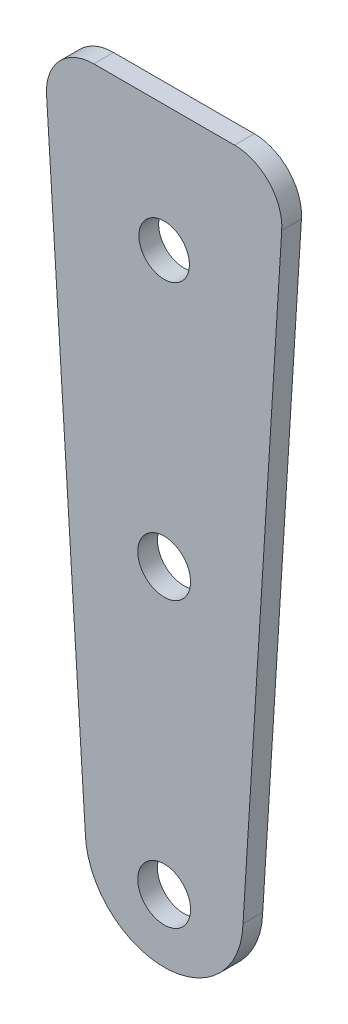
ISO-10303-21;
HEADER;
FILE_DESCRIPTION(('STEP AP214'),'2;1');
FILE_NAME('part.step','',(''),(''),'','','');
FILE_SCHEMA(('AUTOMOTIVE_DESIGN { 1 0 10303 214 1 1 1 1 }'));
ENDSEC;
DATA;
#1=APPLICATION_CONTEXT('core data for automotive mechanical design processes');
#2=APPLICATION_PROTOCOL_DEFINITION('international standard','automotive_design',2000,#1);
#3=PRODUCT_CONTEXT('',#1,'mechanical');
#4=PRODUCT('Part','Part','',(#3));
#5=PRODUCT_RELATED_PRODUCT_CATEGORY('part','',(#4));
#6=PRODUCT_DEFINITION_FORMATION('','',#4);
#7=PRODUCT_DEFINITION_CONTEXT('part definition',#1,'design');
#8=PRODUCT_DEFINITION('design','',#6,#7);
#9=PRODUCT_DEFINITION_SHAPE('','',#8);
#10=(LENGTH_UNIT() NAMED_UNIT(*) SI_UNIT(.MILLI.,.METRE.));
#11=(NAMED_UNIT(*) PLANE_ANGLE_UNIT() SI_UNIT($,.RADIAN.));
#12=(NAMED_UNIT(*) SI_UNIT($,.STERADIAN.) SOLID_ANGLE_UNIT());
#13=UNCERTAINTY_MEASURE_WITH_UNIT(LENGTH_MEASURE(1.E-05),#10,'distance_accuracy_value','');
#14=(GEOMETRIC_REPRESENTATION_CONTEXT(3) GLOBAL_UNCERTAINTY_ASSIGNED_CONTEXT((#13)) GLOBAL_UNIT_ASSIGNED_CONTEXT((#10,
#11,#12)) REPRESENTATION_CONTEXT('',''));
#15=CARTESIAN_POINT('',(0.,0.,0.));
#16=DIRECTION('',(0.,0.,1.));
#17=DIRECTION('',(1.,0.,0.));
#18=AXIS2_PLACEMENT_3D('',#15,#16,#17);
#19=CARTESIAN_POINT('',(0.0147414642697603,-105.114260788739,-76.2));
#20=DIRECTION('',(0.,0.,1.));
#21=DIRECTION('',(1.,0.,0.));
#22=AXIS2_PLACEMENT_3D('',#19,#20,#21);
#23=CYLINDRICAL_SURFACE('',#22,6.35136235795166);
#24=DIRECTION('',(0.,0.,1.));
#25=VECTOR('',#24,1.);
#26=CARTESIAN_POINT('',(-6.33525853573024,-105.24580470538,-76.2));
#27=LINE('',#26,#25);
#28=CARTESIAN_POINT('',(-6.33525853573024,-105.24580470538,45.9104999999999));
#29=VERTEX_POINT('',#28);
#30=CARTESIAN_POINT('',(-6.33525853573024,-105.24580470538,47.4979999999999));
#31=VERTEX_POINT('',#30);
#32=EDGE_CURVE('E119',#29,#31,#27,.T.);
#33=ORIENTED_EDGE('',*,*,#32,.F.);
#34=CARTESIAN_POINT('',(0.0147414642697603,-105.114260788739,45.9104999999999));
#35=DIRECTION('',(0.,0.,1.));
#36=DIRECTION('',(1.,0.,0.));
#37=AXIS2_PLACEMENT_3D('',#34,#35,#36);
#38=CIRCLE('',#37,6.35136235795166);
#39=CARTESIAN_POINT('',(6.36474146426976,-105.24580470538,45.9104999999999));
#40=VERTEX_POINT('',#39);
#41=EDGE_CURVE('E122',#40,#29,#38,.F.);
#42=ORIENTED_EDGE('',*,*,#41,.F.);
#43=DIRECTION('',(0.,0.,1.));
#44=VECTOR('',#43,1.);
#45=CARTESIAN_POINT('',(6.36474146426976,-105.24580470538,-76.2));
#46=LINE('',#45,#44);
#47=CARTESIAN_POINT('',(6.36474146426976,-105.24580470538,47.4979999999999));
#48=VERTEX_POINT('',#47);
#49=EDGE_CURVE('E115',#40,#48,#46,.T.);
#50=ORIENTED_EDGE('',*,*,#49,.T.);
#51=CARTESIAN_POINT('',(0.0147414642697603,-105.114260788739,47.4979999999999));
#52=DIRECTION('',(0.,0.,-1.));
#53=DIRECTION('',(-1.,0.,0.));
#54=AXIS2_PLACEMENT_3D('',#51,#52,#53);
#55=CIRCLE('',#54,6.35136235795166);
#56=EDGE_CURVE('E97',#31,#48,#55,.F.);
#57=ORIENTED_EDGE('',*,*,#56,.F.);
#58=EDGE_LOOP('',(#33,#42,#50,#57));
#59=FACE_BOUND('',#58,.T.);
#60=ADVANCED_FACE('F41',(#59),#23,.T.);
#61=CARTESIAN_POINT('',(-6.33525853573024,-105.24580470538,-76.2));
#62=DIRECTION('',(-0.998052578482889,-0.0623782861551806,0.));
#63=DIRECTION('',(0.0623782861551806,-0.998052578482889,0.));
#64=AXIS2_PLACEMENT_3D('',#61,#62,#63);
#65=PLANE('',#64);
#66=DIRECTION('',(-0.0623782861551806,0.998052578482889,0.));
#67=VECTOR('',#66,1.);
#68=CARTESIAN_POINT('',(-6.33525853573024,-105.24580470538,45.9104999999999));
#69=LINE('',#68,#67);
#70=CARTESIAN_POINT('',(-9.45391718746499,-55.3472662776241,45.9104999999999));
#71=VERTEX_POINT('',#70);
#72=EDGE_CURVE('E59',#29,#71,#69,.T.);
#73=ORIENTED_EDGE('',*,*,#72,.F.);
#74=ORIENTED_EDGE('',*,*,#32,.T.);
#75=DIRECTION('',(0.0623782861551806,-0.998052578482889,0.));
#76=VECTOR('',#75,1.);
#77=CARTESIAN_POINT('',(-6.33525853573024,-105.24580470538,47.4979999999999));
#78=LINE('',#77,#76);
#79=CARTESIAN_POINT('',(-9.45391718746499,-55.3472662776241,47.4979999999999));
#80=VERTEX_POINT('',#79);
#81=EDGE_CURVE('E103',#80,#31,#78,.T.);
#82=ORIENTED_EDGE('',*,*,#81,.F.);
#83=DIRECTION('',(0.,0.,1.));
#84=VECTOR('',#83,1.);
#85=CARTESIAN_POINT('',(-9.45391718746499,-55.3472662776241,-47.625));
#86=LINE('',#85,#84);
#87=EDGE_CURVE('E11',#80,#71,#86,.F.);
#88=ORIENTED_EDGE('',*,*,#87,.T.);
#89=EDGE_LOOP('',(#73,#74,#82,#88));
#90=FACE_BOUND('',#89,.T.);
#91=ADVANCED_FACE('F214',(#90),#65,.T.);
#92=CARTESIAN_POINT('',(6.36474146426976,-105.24580470538,-76.2));
#93=DIRECTION('',(0.998052578482889,-0.0623782861551805,0.));
#94=DIRECTION('',(0.0623782861551805,0.998052578482889,0.));
#95=AXIS2_PLACEMENT_3D('',#92,#93,#94);
#96=PLANE('',#95);
#97=DIRECTION('',(-0.0623782861551805,-0.998052578482889,0.));
#98=VECTOR('',#97,1.);
#99=CARTESIAN_POINT('',(6.36474146426976,-105.24580470538,45.9104999999999));
#100=LINE('',#99,#98);
#101=CARTESIAN_POINT('',(9.4834001160045,-55.3472662776241,45.9104999999999));
#102=VERTEX_POINT('',#101);
#103=EDGE_CURVE('E151',#102,#40,#100,.T.);
#104=ORIENTED_EDGE('',*,*,#103,.F.);
#105=DIRECTION('',(0.,0.,-1.));
#106=VECTOR('',#105,1.);
#107=CARTESIAN_POINT('',(9.4834001160045,-55.3472662776241,47.4979999999999));
#108=LINE('',#107,#106);
#109=CARTESIAN_POINT('',(9.4834001160045,-55.3472662776241,47.4979999999999));
#110=VERTEX_POINT('',#109);
#111=EDGE_CURVE('E117',#102,#110,#108,.F.);
#112=ORIENTED_EDGE('',*,*,#111,.T.);
#113=DIRECTION('',(0.0623782861551805,0.998052578482889,0.));
#114=VECTOR('',#113,1.);
#115=CARTESIAN_POINT('',(6.36474146426976,-105.24580470538,47.4979999999999));
#116=LINE('',#115,#114);
#117=EDGE_CURVE('E101',#48,#110,#116,.T.);
#118=ORIENTED_EDGE('',*,*,#117,.F.);
#119=ORIENTED_EDGE('',*,*,#49,.F.);
#120=EDGE_LOOP('',(#104,#112,#118,#119));
#121=FACE_BOUND('',#120,.T.);
#122=ADVANCED_FACE('F114',(#121),#96,.T.);
#123=CARTESIAN_POINT('',(-12.6852585357302,-51.2996050073729,47.4979999999999));
#124=DIRECTION('',(0.,-1.,0.));
#125=DIRECTION('',(0.,0.,-1.));
#126=AXIS2_PLACEMENT_3D('',#123,#124,#125);
#127=PLANE('',#126);
#128=DIRECTION('',(0.,0.,-1.));
#129=VECTOR('',#128,1.);
#130=CARTESIAN_POINT('',(5.6808197919847,-51.2996050073729,-47.625));
#131=LINE('',#130,#129);
#132=CARTESIAN_POINT('',(5.6808197919847,-51.2996050073729,47.4979999999999));
#133=VERTEX_POINT('',#132);
#134=CARTESIAN_POINT('',(5.6808197919847,-51.2996050073729,45.9104999999999));
#135=VERTEX_POINT('',#134);
#136=EDGE_CURVE('E136',#133,#135,#131,.T.);
#137=ORIENTED_EDGE('',*,*,#136,.T.);
#138=DIRECTION('',(-1.,0.,0.));
#139=VECTOR('',#138,1.);
#140=CARTESIAN_POINT('',(-12.6852585357302,-51.2996050073729,45.9104999999999));
#141=LINE('',#140,#139);
#142=CARTESIAN_POINT('',(-5.65133686344518,-51.2996050073729,45.9104999999999));
#143=VERTEX_POINT('',#142);
#144=EDGE_CURVE('E162',#135,#143,#141,.T.);
#145=ORIENTED_EDGE('',*,*,#144,.T.);
#146=DIRECTION('',(0.,0.,1.));
#147=VECTOR('',#146,1.);
#148=CARTESIAN_POINT('',(-5.65133686344518,-51.2996050073729,47.4979999999999));
#149=LINE('',#148,#147);
#150=CARTESIAN_POINT('',(-5.65133686344518,-51.2996050073729,47.4979999999999));
#151=VERTEX_POINT('',#150);
#152=EDGE_CURVE('E133',#143,#151,#149,.T.);
#153=ORIENTED_EDGE('',*,*,#152,.T.);
#154=DIRECTION('',(1.,0.,0.));
#155=VECTOR('',#154,1.);
#156=CARTESIAN_POINT('',(-12.6852585357302,-51.2996050073729,47.4979999999999));
#157=LINE('',#156,#155);
#158=EDGE_CURVE('E128',#151,#133,#157,.T.);
#159=ORIENTED_EDGE('',*,*,#158,.T.);
#160=EDGE_LOOP('',(#137,#145,#153,#159));
#161=FACE_BOUND('',#160,.T.);
#162=ADVANCED_FACE('F200',(#161),#127,.F.);
#163=CARTESIAN_POINT('',(-12.6852585357302,-73.5246050073729,47.4979999999999));
#164=DIRECTION('',(0.,0.,-1.));
#165=DIRECTION('',(-1.,0.,0.));
#166=AXIS2_PLACEMENT_3D('',#163,#164,#165);
#167=PLANE('',#166);
#168=CARTESIAN_POINT('',(0.0147414642697539,-106.385623146691,47.4979999999999));
#169=DIRECTION('',(0.,0.,1.));
#170=DIRECTION('',(1.,0.,0.));
#171=AXIS2_PLACEMENT_3D('',#168,#169,#170);
#172=CIRCLE('',#171,2.127);
#173=CARTESIAN_POINT('',(2.14174146426975,-106.385623146691,47.4979999999999));
#174=VERTEX_POINT('',#173);
#175=EDGE_CURVE('E179',#174,#174,#172,.T.);
#176=ORIENTED_EDGE('',*,*,#175,.F.);
#177=EDGE_LOOP('',(#176));
#178=FACE_BOUND('',#177,.T.);
#179=CARTESIAN_POINT('',(0.0147414642697511,-83.5256231466905,47.4979999999999));
#180=DIRECTION('',(0.,0.,1.));
#181=DIRECTION('',(1.,0.,0.));
#182=AXIS2_PLACEMENT_3D('',#179,#180,#181);
#183=CIRCLE('',#182,2.127);
#184=CARTESIAN_POINT('',(2.14174146426975,-83.5256231466905,47.4979999999999));
#185=VERTEX_POINT('',#184);
#186=EDGE_CURVE('E171',#185,#185,#183,.T.);
#187=ORIENTED_EDGE('',*,*,#186,.F.);
#188=EDGE_LOOP('',(#187));
#189=FACE_BOUND('',#188,.T.);
#190=ORIENTED_EDGE('',*,*,#56,.T.);
#191=ORIENTED_EDGE('',*,*,#117,.T.);
#192=CARTESIAN_POINT('',(5.6808197919847,-55.1096050073729,47.4979999999999));
#193=DIRECTION('',(0.,0.,-1.));
#194=DIRECTION('',(-1.,0.,0.));
#195=AXIS2_PLACEMENT_3D('',#192,#193,#194);
#196=CIRCLE('',#195,3.81);
#197=EDGE_CURVE('E51',#110,#133,#196,.F.);
#198=ORIENTED_EDGE('',*,*,#197,.T.);
#199=ORIENTED_EDGE('',*,*,#158,.F.);
#200=CARTESIAN_POINT('',(-5.65133686344518,-55.1096050073729,47.4979999999999));
#201=DIRECTION('',(0.,0.,-1.));
#202=DIRECTION('',(-1.,0.,0.));
#203=AXIS2_PLACEMENT_3D('',#200,#201,#202);
#204=CIRCLE('',#203,3.81);
#205=EDGE_CURVE('E67',#151,#80,#204,.F.);
#206=ORIENTED_EDGE('',*,*,#205,.T.);
#207=ORIENTED_EDGE('',*,*,#81,.T.);
#208=EDGE_LOOP('',(#190,#191,#198,#199,#206,#207));
#209=FACE_BOUND('',#208,.T.);
#210=CARTESIAN_POINT('',(0.0147414642697558,-61.4596050073729,47.4979999999999));
#211=DIRECTION('',(0.,0.,-1.));
#212=DIRECTION('',(-1.,0.,0.));
#213=AXIS2_PLACEMENT_3D('',#210,#211,#212);
#214=CIRCLE('',#213,2.032);
#215=CARTESIAN_POINT('',(-2.01725853573024,-61.4596050073729,47.4979999999999));
#216=VERTEX_POINT('',#215);
#217=EDGE_CURVE('E143',#216,#216,#214,.T.);
#218=ORIENTED_EDGE('',*,*,#217,.T.);
#219=EDGE_LOOP('',(#218));
#220=FACE_BOUND('',#219,.T.);
#221=ADVANCED_FACE('F99',(#178,#189,#209,#220),#167,.F.);
#222=CARTESIAN_POINT('',(5.6808197919847,-55.1096050073729,47.4979999999999));
#223=DIRECTION('',(0.,0.,1.));
#224=DIRECTION('',(1.,0.,0.));
#225=AXIS2_PLACEMENT_3D('',#222,#223,#224);
#226=CYLINDRICAL_SURFACE('',#225,3.81);
#227=CARTESIAN_POINT('',(5.6808197919847,-55.1096050073729,45.9104999999999));
#228=DIRECTION('',(0.,0.,1.));
#229=DIRECTION('',(1.,0.,0.));
#230=AXIS2_PLACEMENT_3D('',#227,#228,#229);
#231=CIRCLE('',#230,3.81);
#232=EDGE_CURVE('E154',#135,#102,#231,.F.);
#233=ORIENTED_EDGE('',*,*,#232,.F.);
#234=ORIENTED_EDGE('',*,*,#136,.F.);
#235=ORIENTED_EDGE('',*,*,#197,.F.);
#236=ORIENTED_EDGE('',*,*,#111,.F.);
#237=EDGE_LOOP('',(#233,#234,#235,#236));
#238=FACE_BOUND('',#237,.T.);
#239=ADVANCED_FACE('F199',(#238),#226,.T.);
#240=CARTESIAN_POINT('',(-5.65133686344518,-55.1096050073729,47.4979999999999));
#241=DIRECTION('',(0.,0.,-1.));
#242=DIRECTION('',(-1.,0.,0.));
#243=AXIS2_PLACEMENT_3D('',#240,#241,#242);
#244=CYLINDRICAL_SURFACE('',#243,3.81);
#245=CARTESIAN_POINT('',(-5.65133686344518,-55.1096050073729,45.9104999999999));
#246=DIRECTION('',(0.,0.,1.));
#247=DIRECTION('',(1.,0.,0.));
#248=AXIS2_PLACEMENT_3D('',#245,#246,#247);
#249=CIRCLE('',#248,3.81);
#250=EDGE_CURVE('E165',#71,#143,#249,.F.);
#251=ORIENTED_EDGE('',*,*,#250,.F.);
#252=ORIENTED_EDGE('',*,*,#87,.F.);
#253=ORIENTED_EDGE('',*,*,#205,.F.);
#254=ORIENTED_EDGE('',*,*,#152,.F.);
#255=EDGE_LOOP('',(#251,#252,#253,#254));
#256=FACE_BOUND('',#255,.T.);
#257=ADVANCED_FACE('F43',(#256),#244,.T.);
#258=CARTESIAN_POINT('',(0.0147414642697558,-61.4596050073729,60.1979999999999));
#259=DIRECTION('',(0.,0.,-1.));
#260=DIRECTION('',(-1.,0.,0.));
#261=AXIS2_PLACEMENT_3D('',#258,#259,#260);
#262=CYLINDRICAL_SURFACE('',#261,2.032);
#263=CARTESIAN_POINT('',(0.0147414642697558,-61.4596050073729,45.9104999999999));
#264=DIRECTION('',(0.,0.,1.));
#265=DIRECTION('',(1.,0.,0.));
#266=AXIS2_PLACEMENT_3D('',#263,#264,#265);
#267=CIRCLE('',#266,2.032);
#268=CARTESIAN_POINT('',(2.04674146426976,-61.4596050073729,45.9104999999999));
#269=VERTEX_POINT('',#268);
#270=EDGE_CURVE('E45',#269,#269,#267,.F.);
#271=ORIENTED_EDGE('',*,*,#270,.T.);
#272=EDGE_LOOP('',(#271));
#273=FACE_BOUND('',#272,.T.);
#274=ORIENTED_EDGE('',*,*,#217,.F.);
#275=EDGE_LOOP('',(#274));
#276=FACE_BOUND('',#275,.T.);
#277=ADVANCED_FACE('F210',(#273,#276),#262,.F.);
#278=CARTESIAN_POINT('',(-65.0326399581992,-111.465623146691,45.9104999999999));
#279=DIRECTION('',(0.,0.,1.));
#280=DIRECTION('',(1.,0.,0.));
#281=AXIS2_PLACEMENT_3D('',#278,#279,#280);
#282=PLANE('',#281);
#283=CARTESIAN_POINT('',(0.0147414642697539,-106.385623146691,45.9104999999999));
#284=DIRECTION('',(0.,0.,1.));
#285=DIRECTION('',(1.,0.,0.));
#286=AXIS2_PLACEMENT_3D('',#283,#284,#285);
#287=CIRCLE('',#286,2.127);
#288=CARTESIAN_POINT('',(2.14174146426975,-106.385623146691,45.9104999999999));
#289=VERTEX_POINT('',#288);
#290=EDGE_CURVE('E109',#289,#289,#287,.T.);
#291=ORIENTED_EDGE('',*,*,#290,.T.);
#292=EDGE_LOOP('',(#291));
#293=FACE_BOUND('',#292,.T.);
#294=CARTESIAN_POINT('',(0.0147414642697511,-83.5256231466905,45.9104999999999));
#295=DIRECTION('',(0.,0.,1.));
#296=DIRECTION('',(1.,0.,0.));
#297=AXIS2_PLACEMENT_3D('',#294,#295,#296);
#298=CIRCLE('',#297,2.127);
#299=CARTESIAN_POINT('',(2.14174146426975,-83.5256231466905,45.9104999999999));
#300=VERTEX_POINT('',#299);
#301=EDGE_CURVE('E175',#300,#300,#298,.T.);
#302=ORIENTED_EDGE('',*,*,#301,.T.);
#303=EDGE_LOOP('',(#302));
#304=FACE_BOUND('',#303,.T.);
#305=ORIENTED_EDGE('',*,*,#41,.T.);
#306=ORIENTED_EDGE('',*,*,#72,.T.);
#307=ORIENTED_EDGE('',*,*,#250,.T.);
#308=ORIENTED_EDGE('',*,*,#144,.F.);
#309=ORIENTED_EDGE('',*,*,#232,.T.);
#310=ORIENTED_EDGE('',*,*,#103,.T.);
#311=EDGE_LOOP('',(#305,#306,#307,#308,#309,#310));
#312=FACE_BOUND('',#311,.T.);
#313=ORIENTED_EDGE('',*,*,#270,.F.);
#314=EDGE_LOOP('',(#313));
#315=FACE_BOUND('',#314,.T.);
#316=ADVANCED_FACE('F187',(#293,#304,#312,#315),#282,.F.);
#317=CARTESIAN_POINT('',(0.0147414642697511,-83.5256231466905,45.9104999999999));
#318=DIRECTION('',(0.,0.,1.));
#319=DIRECTION('',(1.,0.,0.));
#320=AXIS2_PLACEMENT_3D('',#317,#318,#319);
#321=CYLINDRICAL_SURFACE('',#320,2.127);
#322=ORIENTED_EDGE('',*,*,#301,.F.);
#323=EDGE_LOOP('',(#322));
#324=FACE_BOUND('',#323,.T.);
#325=ORIENTED_EDGE('',*,*,#186,.T.);
#326=EDGE_LOOP('',(#325));
#327=FACE_BOUND('',#326,.T.);
#328=ADVANCED_FACE('F193',(#324,#327),#321,.F.);
#329=CARTESIAN_POINT('',(0.0147414642697539,-106.385623146691,45.9104999999999));
#330=DIRECTION('',(0.,0.,1.));
#331=DIRECTION('',(1.,0.,0.));
#332=AXIS2_PLACEMENT_3D('',#329,#330,#331);
#333=CYLINDRICAL_SURFACE('',#332,2.127);
#334=ORIENTED_EDGE('',*,*,#290,.F.);
#335=EDGE_LOOP('',(#334));
#336=FACE_BOUND('',#335,.T.);
#337=ORIENTED_EDGE('',*,*,#175,.T.);
#338=EDGE_LOOP('',(#337));
#339=FACE_BOUND('',#338,.T.);
#340=ADVANCED_FACE('F190',(#336,#339),#333,.F.);
#341=CLOSED_SHELL('',(#60,#91,#122,#162,#221,#239,#257,#277,#316,#328,#340));
#342=MANIFOLD_SOLID_BREP('B2',#341);
#343=ADVANCED_BREP_SHAPE_REPRESENTATION('',(#18,#342),#14);
#344=SHAPE_DEFINITION_REPRESENTATION(#9,#343);
ENDSEC;
END-ISO-10303-21;
